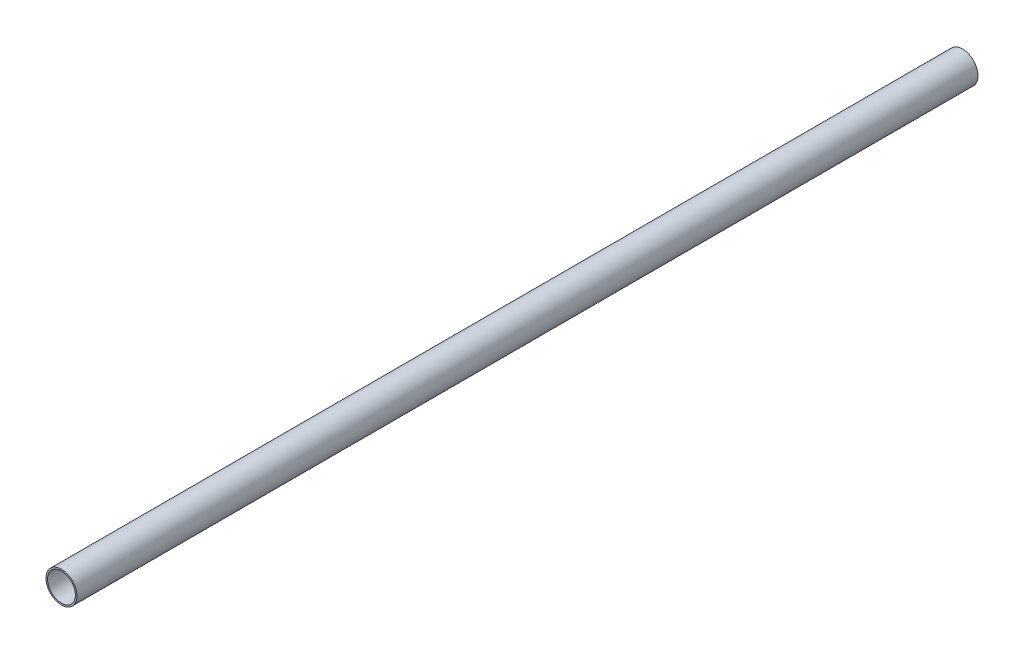
ISO-10303-21;
HEADER;
FILE_DESCRIPTION(('STEP AP214'),'2;1');
FILE_NAME('part.step','',(''),(''),'','','');
FILE_SCHEMA(('AUTOMOTIVE_DESIGN { 1 0 10303 214 1 1 1 1 }'));
ENDSEC;
DATA;
#1=APPLICATION_CONTEXT('core data for automotive mechanical design processes');
#2=APPLICATION_PROTOCOL_DEFINITION('international standard','automotive_design',2000,#1);
#3=PRODUCT_CONTEXT('',#1,'mechanical');
#4=PRODUCT('Part','Part','',(#3));
#5=PRODUCT_RELATED_PRODUCT_CATEGORY('part','',(#4));
#6=PRODUCT_DEFINITION_FORMATION('','',#4);
#7=PRODUCT_DEFINITION_CONTEXT('part definition',#1,'design');
#8=PRODUCT_DEFINITION('design','',#6,#7);
#9=PRODUCT_DEFINITION_SHAPE('','',#8);
#10=(LENGTH_UNIT() NAMED_UNIT(*) SI_UNIT(.MILLI.,.METRE.));
#11=(NAMED_UNIT(*) PLANE_ANGLE_UNIT() SI_UNIT($,.RADIAN.));
#12=(NAMED_UNIT(*) SI_UNIT($,.STERADIAN.) SOLID_ANGLE_UNIT());
#13=UNCERTAINTY_MEASURE_WITH_UNIT(LENGTH_MEASURE(1.E-05),#10,'distance_accuracy_value','');
#14=(GEOMETRIC_REPRESENTATION_CONTEXT(3) GLOBAL_UNCERTAINTY_ASSIGNED_CONTEXT((#13)) GLOBAL_UNIT_ASSIGNED_CONTEXT((#10,
#11,#12)) REPRESENTATION_CONTEXT('',''));
#15=CARTESIAN_POINT('',(0.,0.,0.));
#16=DIRECTION('',(0.,0.,1.));
#17=DIRECTION('',(1.,0.,0.));
#18=AXIS2_PLACEMENT_3D('',#15,#16,#17);
#19=CARTESIAN_POINT('',(0.,0.,0.));
#20=DIRECTION('',(0.,0.,1.));
#21=DIRECTION('',(1.,0.,0.));
#22=AXIS2_PLACEMENT_3D('',#19,#20,#21);
#23=PLANE('',#22);
#24=CARTESIAN_POINT('',(0.,0.,0.));
#25=DIRECTION('',(0.,0.,1.));
#26=DIRECTION('',(1.,0.,0.));
#27=AXIS2_PLACEMENT_3D('',#24,#25,#26);
#28=CIRCLE('',#27,4.5);
#29=CARTESIAN_POINT('',(4.5,0.,0.));
#30=VERTEX_POINT('',#29);
#31=EDGE_CURVE('E51',#30,#30,#28,.T.);
#32=ORIENTED_EDGE('',*,*,#31,.F.);
#33=EDGE_LOOP('',(#32));
#34=FACE_BOUND('',#33,.T.);
#35=CARTESIAN_POINT('',(0.,0.,0.));
#36=DIRECTION('',(0.,0.,1.));
#37=DIRECTION('',(1.,0.,0.));
#38=AXIS2_PLACEMENT_3D('',#35,#36,#37);
#39=CIRCLE('',#38,5.);
#40=CARTESIAN_POINT('',(5.,0.,0.));
#41=VERTEX_POINT('',#40);
#42=EDGE_CURVE('E43',#41,#41,#39,.T.);
#43=ORIENTED_EDGE('',*,*,#42,.T.);
#44=EDGE_LOOP('',(#43));
#45=FACE_BOUND('',#44,.T.);
#46=ADVANCED_FACE('F37',(#34,#45),#23,.T.);
#47=CARTESIAN_POINT('',(0.,0.,-291.));
#48=DIRECTION('',(0.,0.,1.));
#49=DIRECTION('',(1.,0.,0.));
#50=AXIS2_PLACEMENT_3D('',#47,#48,#49);
#51=PLANE('',#50);
#52=CARTESIAN_POINT('',(0.,0.,-291.));
#53=DIRECTION('',(0.,0.,1.));
#54=DIRECTION('',(1.,0.,0.));
#55=AXIS2_PLACEMENT_3D('',#52,#53,#54);
#56=CIRCLE('',#55,4.5);
#57=CARTESIAN_POINT('',(4.5,0.,-291.));
#58=VERTEX_POINT('',#57);
#59=EDGE_CURVE('E47',#58,#58,#56,.T.);
#60=ORIENTED_EDGE('',*,*,#59,.T.);
#61=EDGE_LOOP('',(#60));
#62=FACE_BOUND('',#61,.T.);
#63=CARTESIAN_POINT('',(0.,0.,-291.));
#64=DIRECTION('',(0.,0.,1.));
#65=DIRECTION('',(1.,0.,0.));
#66=AXIS2_PLACEMENT_3D('',#63,#64,#65);
#67=CIRCLE('',#66,5.);
#68=CARTESIAN_POINT('',(5.,0.,-291.));
#69=VERTEX_POINT('',#68);
#70=EDGE_CURVE('E10',#69,#69,#67,.T.);
#71=ORIENTED_EDGE('',*,*,#70,.F.);
#72=EDGE_LOOP('',(#71));
#73=FACE_BOUND('',#72,.T.);
#74=ADVANCED_FACE('F60',(#62,#73),#51,.F.);
#75=CARTESIAN_POINT('',(0.,0.,0.));
#76=DIRECTION('',(0.,0.,-1.));
#77=DIRECTION('',(-1.,0.,0.));
#78=AXIS2_PLACEMENT_3D('',#75,#76,#77);
#79=CYLINDRICAL_SURFACE('',#78,5.);
#80=ORIENTED_EDGE('',*,*,#70,.T.);
#81=EDGE_LOOP('',(#80));
#82=FACE_BOUND('',#81,.T.);
#83=ORIENTED_EDGE('',*,*,#42,.F.);
#84=EDGE_LOOP('',(#83));
#85=FACE_BOUND('',#84,.T.);
#86=ADVANCED_FACE('F65',(#82,#85),#79,.T.);
#87=CARTESIAN_POINT('',(0.,0.,0.));
#88=DIRECTION('',(0.,0.,-1.));
#89=DIRECTION('',(-1.,0.,0.));
#90=AXIS2_PLACEMENT_3D('',#87,#88,#89);
#91=CYLINDRICAL_SURFACE('',#90,4.5);
#92=ORIENTED_EDGE('',*,*,#59,.F.);
#93=EDGE_LOOP('',(#92));
#94=FACE_BOUND('',#93,.T.);
#95=ORIENTED_EDGE('',*,*,#31,.T.);
#96=EDGE_LOOP('',(#95));
#97=FACE_BOUND('',#96,.T.);
#98=ADVANCED_FACE('F57',(#94,#97),#91,.F.);
#99=CLOSED_SHELL('',(#46,#74,#86,#98));
#100=MANIFOLD_SOLID_BREP('B2',#99);
#101=ADVANCED_BREP_SHAPE_REPRESENTATION('',(#18,#100),#14);
#102=SHAPE_DEFINITION_REPRESENTATION(#9,#101);
ENDSEC;
END-ISO-10303-21;
